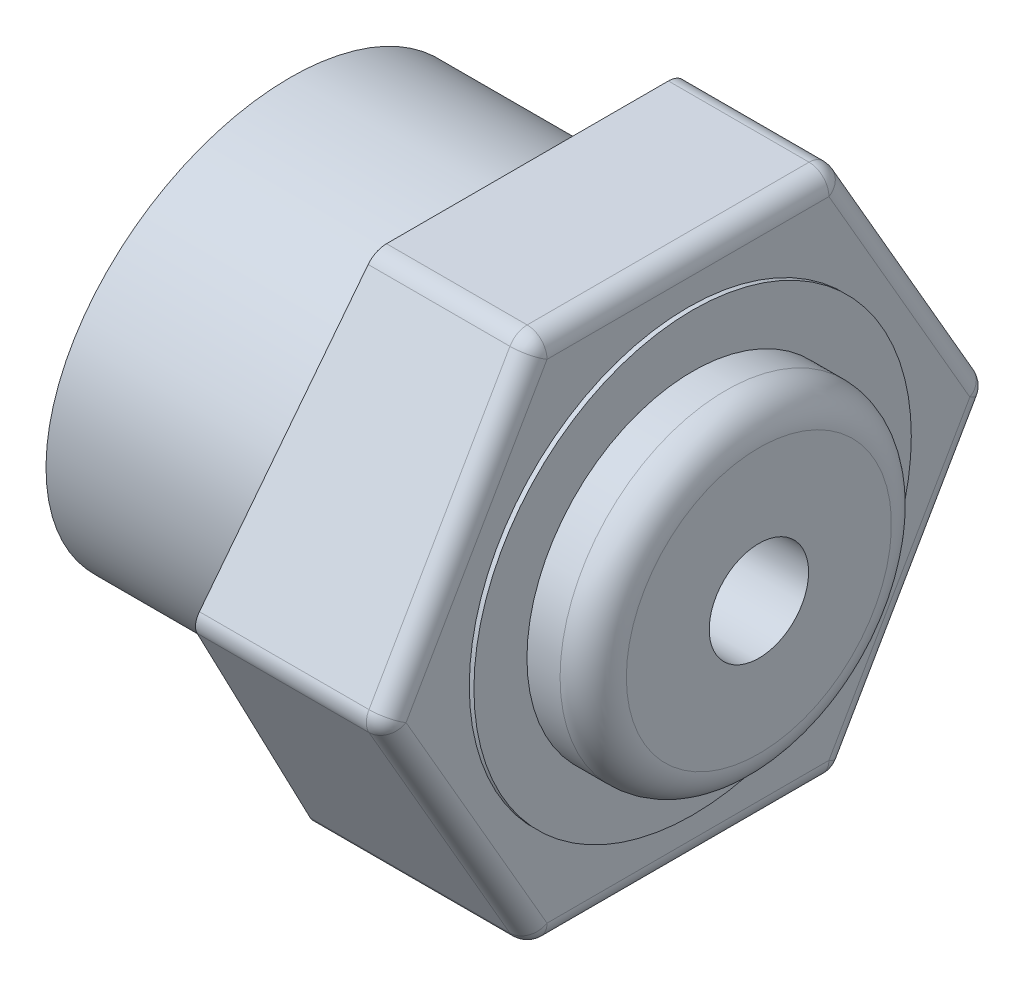
ISO-10303-21;
HEADER;
FILE_DESCRIPTION(('STEP AP214'),'2;1');
FILE_NAME('part.step','',(''),(''),'','','');
FILE_SCHEMA(('AUTOMOTIVE_DESIGN { 1 0 10303 214 1 1 1 1 }'));
ENDSEC;
DATA;
#1=APPLICATION_CONTEXT('core data for automotive mechanical design processes');
#2=APPLICATION_PROTOCOL_DEFINITION('international standard','automotive_design',2000,#1);
#3=PRODUCT_CONTEXT('',#1,'mechanical');
#4=PRODUCT('Part','Part','',(#3));
#5=PRODUCT_RELATED_PRODUCT_CATEGORY('part','',(#4));
#6=PRODUCT_DEFINITION_FORMATION('','',#4);
#7=PRODUCT_DEFINITION_CONTEXT('part definition',#1,'design');
#8=PRODUCT_DEFINITION('design','',#6,#7);
#9=PRODUCT_DEFINITION_SHAPE('','',#8);
#10=(LENGTH_UNIT() NAMED_UNIT(*) SI_UNIT(.MILLI.,.METRE.));
#11=(NAMED_UNIT(*) PLANE_ANGLE_UNIT() SI_UNIT($,.RADIAN.));
#12=(NAMED_UNIT(*) SI_UNIT($,.STERADIAN.) SOLID_ANGLE_UNIT());
#13=UNCERTAINTY_MEASURE_WITH_UNIT(LENGTH_MEASURE(1.E-05),#10,'distance_accuracy_value','');
#14=(GEOMETRIC_REPRESENTATION_CONTEXT(3) GLOBAL_UNCERTAINTY_ASSIGNED_CONTEXT((#13)) GLOBAL_UNIT_ASSIGNED_CONTEXT((#10,
#11,#12)) REPRESENTATION_CONTEXT('',''));
#15=CARTESIAN_POINT('',(0.,0.,0.));
#16=DIRECTION('',(0.,0.,1.));
#17=DIRECTION('',(1.,0.,0.));
#18=AXIS2_PLACEMENT_3D('',#15,#16,#17);
#19=CARTESIAN_POINT('',(3.33,3.98371685740838,2.30000000000004));
#20=DIRECTION('',(0.,-0.499999999999995,-0.866025403784441));
#21=DIRECTION('',(0.,0.866025403784441,-0.499999999999995));
#22=AXIS2_PLACEMENT_3D('',#19,#20,#21);
#23=PLANE('',#22);
#24=DIRECTION('',(-1.,0.,0.));
#25=VECTOR('',#24,1.);
#26=CARTESIAN_POINT('',(3.33,3.83371685740838,2.38660254037848));
#27=LINE('',#26,#25);
#28=CARTESIAN_POINT('',(3.03,3.83371685740838,2.38660254037848));
#29=VERTEX_POINT('',#28);
#30=CARTESIAN_POINT('',(0.890684065655473,3.83371685740838,2.38660254037848));
#31=VERTEX_POINT('',#30);
#32=EDGE_CURVE('E188',#29,#31,#27,.T.);
#33=ORIENTED_EDGE('',*,*,#32,.T.);
#34=DIRECTION('',(-0.0981942796621983,-0.861840131684074,0.497583632026216));
#35=VECTOR('',#34,1.);
#36=CARTESIAN_POINT('',(0.93112978840007,4.18870441000489,2.18165038132793));
#37=LINE('',#36,#35);
#38=CARTESIAN_POINT('',(0.470977544695609,0.15,4.51339745962155));
#39=VERTEX_POINT('',#38);
#40=EDGE_CURVE('E55',#31,#39,#37,.T.);
#41=ORIENTED_EDGE('',*,*,#40,.T.);
#42=DIRECTION('',(-1.,0.,0.));
#43=VECTOR('',#42,1.);
#44=CARTESIAN_POINT('',(3.33,0.15,4.51339745962155));
#45=LINE('',#44,#43);
#46=CARTESIAN_POINT('',(3.03,0.150000000000001,4.51339745962155));
#47=VERTEX_POINT('',#46);
#48=EDGE_CURVE('E62',#39,#47,#45,.F.);
#49=ORIENTED_EDGE('',*,*,#48,.T.);
#50=DIRECTION('',(0.,-0.866025403784441,0.499999999999995));
#51=VECTOR('',#50,1.);
#52=CARTESIAN_POINT('',(3.03,3.98371685740838,2.30000000000004));
#53=LINE('',#52,#51);
#54=EDGE_CURVE('E191',#47,#29,#53,.F.);
#55=ORIENTED_EDGE('',*,*,#54,.T.);
#56=EDGE_LOOP('',(#33,#41,#49,#55));
#57=FACE_BOUND('',#56,.T.);
#58=ADVANCED_FACE('F39',(#57),#23,.F.);
#59=CARTESIAN_POINT('',(3.33,0.,4.59999999999999));
#60=DIRECTION('',(0.,0.500000000000001,-0.866025403784438));
#61=DIRECTION('',(0.,0.866025403784438,0.500000000000001));
#62=AXIS2_PLACEMENT_3D('',#59,#60,#61);
#63=PLANE('',#62);
#64=DIRECTION('',(-1.,0.,0.));
#65=VECTOR('',#64,1.);
#66=CARTESIAN_POINT('',(3.33,-0.149999999999998,4.51339745962155));
#67=LINE('',#66,#65);
#68=CARTESIAN_POINT('',(3.03,-0.149999999999998,4.51339745962155));
#69=VERTEX_POINT('',#68);
#70=CARTESIAN_POINT('',(0.436796862205115,-0.149999999999998,4.51339745962155));
#71=VERTEX_POINT('',#70);
#72=EDGE_CURVE('E185',#69,#71,#67,.T.);
#73=ORIENTED_EDGE('',*,*,#72,.T.);
#74=DIRECTION('',(-0.098194279662198,-0.86184013168407,-0.497583632026222));
#75=VECTOR('',#74,1.);
#76=CARTESIAN_POINT('',(0.481619018269736,0.243399014871215,4.74052648675638));
#77=LINE('',#76,#75);
#78=CARTESIAN_POINT('',(0.0170903412452472,-3.83371685740842,2.38660254037843));
#79=VERTEX_POINT('',#78);
#80=EDGE_CURVE('E602',#71,#79,#77,.T.);
#81=ORIENTED_EDGE('',*,*,#80,.T.);
#82=DIRECTION('',(-1.,0.,0.));
#83=VECTOR('',#82,1.);
#84=CARTESIAN_POINT('',(3.33,-3.83371685740842,2.38660254037843));
#85=LINE('',#84,#83);
#86=CARTESIAN_POINT('',(3.03,-3.83371685740842,2.38660254037843));
#87=VERTEX_POINT('',#86);
#88=EDGE_CURVE('E181',#79,#87,#85,.F.);
#89=ORIENTED_EDGE('',*,*,#88,.T.);
#90=DIRECTION('',(0.,-0.866025403784438,-0.500000000000001));
#91=VECTOR('',#90,1.);
#92=CARTESIAN_POINT('',(3.03,0.,4.59999999999999));
#93=LINE('',#92,#91);
#94=EDGE_CURVE('E183',#87,#69,#93,.F.);
#95=ORIENTED_EDGE('',*,*,#94,.T.);
#96=EDGE_LOOP('',(#73,#81,#89,#95));
#97=FACE_BOUND('',#96,.T.);
#98=ADVANCED_FACE('F274',(#97),#63,.F.);
#99=CARTESIAN_POINT('',(3.33,-3.98371685740842,2.29999999999999));
#100=DIRECTION('',(0.,1.,0.));
#101=DIRECTION('',(0.,0.,1.));
#102=AXIS2_PLACEMENT_3D('',#99,#100,#101);
#103=PLANE('',#102);
#104=DIRECTION('',(0.,0.,-1.));
#105=VECTOR('',#104,1.);
#106=CARTESIAN_POINT('',(3.03,-3.98371685740842,2.29999999999999));
#107=LINE('',#106,#105);
#108=CARTESIAN_POINT('',(3.03,-3.9837168574084,-2.12679491924313));
#109=VERTEX_POINT('',#108);
#110=CARTESIAN_POINT('',(3.03,-3.98371685740842,2.1267949192431));
#111=VERTEX_POINT('',#110);
#112=EDGE_CURVE('E172',#109,#111,#107,.F.);
#113=ORIENTED_EDGE('',*,*,#112,.T.);
#114=DIRECTION('',(-1.,0.,0.));
#115=VECTOR('',#114,1.);
#116=CARTESIAN_POINT('',(3.33,-3.98371685740842,2.1267949192431));
#117=LINE('',#116,#115);
#118=CARTESIAN_POINT('',(0.,-3.98371685740842,2.1267949192431));
#119=VERTEX_POINT('',#118);
#120=EDGE_CURVE('E164',#111,#119,#117,.T.);
#121=ORIENTED_EDGE('',*,*,#120,.T.);
#122=DIRECTION('',(0.,0.,-1.));
#123=VECTOR('',#122,1.);
#124=CARTESIAN_POINT('',(0.,-3.98371685740842,2.29999999999999));
#125=LINE('',#124,#123);
#126=CARTESIAN_POINT('',(0.,-3.9837168574084,-2.12679491924312));
#127=VERTEX_POINT('',#126);
#128=EDGE_CURVE('E148',#119,#127,#125,.T.);
#129=ORIENTED_EDGE('',*,*,#128,.T.);
#130=DIRECTION('',(-1.,0.,0.));
#131=VECTOR('',#130,1.);
#132=CARTESIAN_POINT('',(3.33,-3.9837168574084,-2.12679491924312));
#133=LINE('',#132,#131);
#134=EDGE_CURVE('E161',#127,#109,#133,.F.);
#135=ORIENTED_EDGE('',*,*,#134,.T.);
#136=EDGE_LOOP('',(#113,#121,#129,#135));
#137=FACE_BOUND('',#136,.T.);
#138=ADVANCED_FACE('F160',(#137),#103,.F.);
#139=CARTESIAN_POINT('',(3.33,-3.9837168574084,-2.30000000000001));
#140=DIRECTION('',(0.,0.499999999999995,0.866025403784442));
#141=DIRECTION('',(0.,-0.866025403784442,0.499999999999995));
#142=AXIS2_PLACEMENT_3D('',#139,#140,#141);
#143=PLANE('',#142);
#144=DIRECTION('',(-1.,0.,0.));
#145=VECTOR('',#144,1.);
#146=CARTESIAN_POINT('',(3.33,-3.8337168574084,-2.38660254037846));
#147=LINE('',#146,#145);
#148=CARTESIAN_POINT('',(3.03,-3.8337168574084,-2.38660254037846));
#149=VERTEX_POINT('',#148);
#150=CARTESIAN_POINT('',(0.0170903412452491,-3.8337168574084,-2.38660254037846));
#151=VERTEX_POINT('',#150);
#152=EDGE_CURVE('E173',#149,#151,#147,.T.);
#153=ORIENTED_EDGE('',*,*,#152,.T.);
#154=DIRECTION('',(0.0981942796621983,0.861840131684074,-0.497583632026216));
#155=VECTOR('',#154,1.);
#156=CARTESIAN_POINT('',(0.0321082481394004,-3.70190638026248,-2.46270335484067));
#157=LINE('',#156,#155);
#158=CARTESIAN_POINT('',(0.436796862205119,-0.149999999999969,-4.51339745962155));
#159=VERTEX_POINT('',#158);
#160=EDGE_CURVE('E151',#151,#159,#157,.T.);
#161=ORIENTED_EDGE('',*,*,#160,.T.);
#162=DIRECTION('',(-1.,0.,0.));
#163=VECTOR('',#162,1.);
#164=CARTESIAN_POINT('',(3.33,-0.149999999999969,-4.51339745962155));
#165=LINE('',#164,#163);
#166=CARTESIAN_POINT('',(3.03,-0.149999999999969,-4.51339745962155));
#167=VERTEX_POINT('',#166);
#168=EDGE_CURVE('E637',#159,#167,#165,.F.);
#169=ORIENTED_EDGE('',*,*,#168,.T.);
#170=DIRECTION('',(0.,0.866025403784442,-0.499999999999995));
#171=VECTOR('',#170,1.);
#172=CARTESIAN_POINT('',(3.03,-3.9837168574084,-2.30000000000001));
#173=LINE('',#172,#171);
#174=EDGE_CURVE('E176',#167,#149,#173,.F.);
#175=ORIENTED_EDGE('',*,*,#174,.T.);
#176=EDGE_LOOP('',(#153,#161,#169,#175));
#177=FACE_BOUND('',#176,.T.);
#178=ADVANCED_FACE('F372',(#177),#143,.F.);
#179=CARTESIAN_POINT('',(3.33,0.,-4.59999999999999));
#180=DIRECTION('',(0.,-0.500000000000007,0.866025403784435));
#181=DIRECTION('',(0.,-0.866025403784435,-0.500000000000007));
#182=AXIS2_PLACEMENT_3D('',#179,#180,#181);
#183=PLANE('',#182);
#184=DIRECTION('',(-1.,0.,0.));
#185=VECTOR('',#184,1.);
#186=CARTESIAN_POINT('',(3.33,0.150000000000031,-4.51339745962155));
#187=LINE('',#186,#185);
#188=CARTESIAN_POINT('',(3.03,0.150000000000031,-4.51339745962155));
#189=VERTEX_POINT('',#188);
#190=CARTESIAN_POINT('',(0.470977544695613,0.150000000000031,-4.51339745962155));
#191=VERTEX_POINT('',#190);
#192=EDGE_CURVE('E634',#189,#191,#187,.T.);
#193=ORIENTED_EDGE('',*,*,#192,.T.);
#194=DIRECTION('',(0.0981942796621976,0.861840131684067,0.497583632026228));
#195=VECTOR('',#194,1.);
#196=CARTESIAN_POINT('',(0.481619018269739,0.243399014871244,-4.4594735132436));
#197=LINE('',#196,#195);
#198=CARTESIAN_POINT('',(0.890684065655478,3.83371685740843,-2.38660254037841));
#199=VERTEX_POINT('',#198);
#200=EDGE_CURVE('E599',#191,#199,#197,.T.);
#201=ORIENTED_EDGE('',*,*,#200,.T.);
#202=DIRECTION('',(-1.,0.,0.));
#203=VECTOR('',#202,1.);
#204=CARTESIAN_POINT('',(3.33,3.83371685740843,-2.38660254037841));
#205=LINE('',#204,#203);
#206=CARTESIAN_POINT('',(3.03,3.83371685740843,-2.3866025403784));
#207=VERTEX_POINT('',#206);
#208=EDGE_CURVE('E630',#199,#207,#205,.F.);
#209=ORIENTED_EDGE('',*,*,#208,.T.);
#210=DIRECTION('',(0.,0.866025403784435,0.500000000000007));
#211=VECTOR('',#210,1.);
#212=CARTESIAN_POINT('',(3.03,0.,-4.59999999999999));
#213=LINE('',#212,#211);
#214=EDGE_CURVE('E632',#207,#189,#213,.F.);
#215=ORIENTED_EDGE('',*,*,#214,.T.);
#216=EDGE_LOOP('',(#193,#201,#209,#215));
#217=FACE_BOUND('',#216,.T.);
#218=ADVANCED_FACE('F362',(#217),#183,.F.);
#219=CARTESIAN_POINT('',(3.33,3.98371685740843,-2.29999999999996));
#220=DIRECTION('',(0.,-1.,0.));
#221=DIRECTION('',(0.,0.,-1.));
#222=AXIS2_PLACEMENT_3D('',#219,#220,#221);
#223=PLANE('',#222);
#224=DIRECTION('',(-1.,0.,0.));
#225=VECTOR('',#224,1.);
#226=CARTESIAN_POINT('',(3.33,3.98371685740843,-2.12679491924307));
#227=LINE('',#226,#225);
#228=CARTESIAN_POINT('',(3.03,3.98371685740843,-2.12679491924307));
#229=VERTEX_POINT('',#228);
#230=CARTESIAN_POINT('',(0.907774406900726,3.98371685740843,-2.12679491924307));
#231=VERTEX_POINT('',#230);
#232=EDGE_CURVE('E622',#229,#231,#227,.T.);
#233=ORIENTED_EDGE('',*,*,#232,.T.);
#234=DIRECTION('',(0.,0.,1.));
#235=VECTOR('',#234,1.);
#236=CARTESIAN_POINT('',(0.907774406900726,3.98371685740843,-2.29999999999996));
#237=LINE('',#236,#235);
#238=CARTESIAN_POINT('',(0.90777440690072,3.98371685740838,2.12679491924315));
#239=VERTEX_POINT('',#238);
#240=EDGE_CURVE('E591',#231,#239,#237,.T.);
#241=ORIENTED_EDGE('',*,*,#240,.T.);
#242=DIRECTION('',(-1.,0.,0.));
#243=VECTOR('',#242,1.);
#244=CARTESIAN_POINT('',(3.33,3.98371685740838,2.12679491924315));
#245=LINE('',#244,#243);
#246=CARTESIAN_POINT('',(3.03,3.98371685740838,2.12679491924315));
#247=VERTEX_POINT('',#246);
#248=EDGE_CURVE('E628',#239,#247,#245,.F.);
#249=ORIENTED_EDGE('',*,*,#248,.T.);
#250=DIRECTION('',(0.,0.,1.));
#251=VECTOR('',#250,1.);
#252=CARTESIAN_POINT('',(3.03,3.98371685740843,-2.29999999999996));
#253=LINE('',#252,#251);
#254=EDGE_CURVE('E625',#247,#229,#253,.F.);
#255=ORIENTED_EDGE('',*,*,#254,.T.);
#256=EDGE_LOOP('',(#233,#241,#249,#255));
#257=FACE_BOUND('',#256,.T.);
#258=ADVANCED_FACE('F356',(#257),#223,.F.);
#259=CARTESIAN_POINT('',(3.33,0.,0.));
#260=DIRECTION('',(1.,0.,0.));
#261=DIRECTION('',(0.,0.,-1.));
#262=AXIS2_PLACEMENT_3D('',#259,#260,#261);
#263=PLANE('',#262);
#264=CARTESIAN_POINT('',(3.33,0.,0.));
#265=DIRECTION('',(1.,0.,0.));
#266=DIRECTION('',(0.,0.,-1.));
#267=AXIS2_PLACEMENT_3D('',#264,#265,#266);
#268=CIRCLE('',#267,3.3);
#269=CARTESIAN_POINT('',(3.33,0.,-3.3));
#270=VERTEX_POINT('',#269);
#271=EDGE_CURVE('E589',#270,#270,#268,.F.);
#272=ORIENTED_EDGE('',*,*,#271,.T.);
#273=EDGE_LOOP('',(#272));
#274=FACE_BOUND('',#273,.T.);
#275=DIRECTION('',(0.,0.866025403784435,0.500000000000007));
#276=VECTOR('',#275,1.);
#277=CARTESIAN_POINT('',(3.33,3.83371685740843,-2.04019237886463));
#278=LINE('',#277,#276);
#279=CARTESIAN_POINT('',(3.33,0.,-4.25358983848621));
#280=VERTEX_POINT('',#279);
#281=CARTESIAN_POINT('',(3.33,3.68371685740843,-2.12679491924307));
#282=VERTEX_POINT('',#281);
#283=EDGE_CURVE('E617',#280,#282,#278,.T.);
#284=ORIENTED_EDGE('',*,*,#283,.T.);
#285=DIRECTION('',(0.,0.,1.));
#286=VECTOR('',#285,1.);
#287=CARTESIAN_POINT('',(3.33,3.68371685740838,2.30000000000004));
#288=LINE('',#287,#286);
#289=CARTESIAN_POINT('',(3.33,3.68371685740838,2.12679491924315));
#290=VERTEX_POINT('',#289);
#291=EDGE_CURVE('E619',#282,#290,#288,.T.);
#292=ORIENTED_EDGE('',*,*,#291,.T.);
#293=DIRECTION('',(0.,-0.866025403784441,0.499999999999995));
#294=VECTOR('',#293,1.);
#295=CARTESIAN_POINT('',(3.33,-0.149999999999998,4.34019237886466));
#296=LINE('',#295,#294);
#297=CARTESIAN_POINT('',(3.33,0.,4.25358983848622));
#298=VERTEX_POINT('',#297);
#299=EDGE_CURVE('E165',#290,#298,#296,.T.);
#300=ORIENTED_EDGE('',*,*,#299,.T.);
#301=DIRECTION('',(0.,-0.866025403784438,-0.500000000000001));
#302=VECTOR('',#301,1.);
#303=CARTESIAN_POINT('',(3.33,-3.83371685740842,2.04019237886466));
#304=LINE('',#303,#302);
#305=CARTESIAN_POINT('',(3.33,-3.68371685740842,2.1267949192431));
#306=VERTEX_POINT('',#305);
#307=EDGE_CURVE('E611',#298,#306,#304,.T.);
#308=ORIENTED_EDGE('',*,*,#307,.T.);
#309=DIRECTION('',(0.,0.,-1.));
#310=VECTOR('',#309,1.);
#311=CARTESIAN_POINT('',(3.33,-3.6837168574084,-2.30000000000001));
#312=LINE('',#311,#310);
#313=CARTESIAN_POINT('',(3.33,-3.6837168574084,-2.12679491924312));
#314=VERTEX_POINT('',#313);
#315=EDGE_CURVE('E613',#306,#314,#312,.T.);
#316=ORIENTED_EDGE('',*,*,#315,.T.);
#317=DIRECTION('',(0.,0.866025403784442,-0.499999999999995));
#318=VECTOR('',#317,1.);
#319=CARTESIAN_POINT('',(3.33,0.150000000000031,-4.34019237886466));
#320=LINE('',#319,#318);
#321=EDGE_CURVE('E615',#314,#280,#320,.T.);
#322=ORIENTED_EDGE('',*,*,#321,.T.);
#323=EDGE_LOOP('',(#284,#292,#300,#308,#316,#322));
#324=FACE_BOUND('',#323,.T.);
#325=ADVANCED_FACE('F351',(#274,#324),#263,.T.);
#326=CARTESIAN_POINT('',(3.33,-3.6837168574084,-2.12679491924312));
#327=DIRECTION('',(-1.,0.,0.));
#328=DIRECTION('',(0.,0.,1.));
#329=AXIS2_PLACEMENT_3D('',#326,#327,#328);
#330=CYLINDRICAL_SURFACE('',#329,0.3);
#331=CARTESIAN_POINT('',(0.0341806824904964,-3.6837168574084,-2.12679491924312));
#332=DIRECTION('',(0.993571855676587,-0.11320321376791,0.));
#333=DIRECTION('',(-0.11320321376791,-0.993571855676587,0.));
#334=AXIS2_PLACEMENT_3D('',#331,#332,#333);
#335=ELLIPSE('',#334,0.301940919809681,0.3);
#336=EDGE_CURVE('E145',#151,#127,#335,.F.);
#337=ORIENTED_EDGE('',*,*,#336,.F.);
#338=ORIENTED_EDGE('',*,*,#152,.F.);
#339=CARTESIAN_POINT('',(3.03,-3.6837168574084,-2.12679491924312));
#340=DIRECTION('',(1.,0.,0.));
#341=DIRECTION('',(0.,0.,-1.));
#342=AXIS2_PLACEMENT_3D('',#339,#340,#341);
#343=CIRCLE('',#342,0.3);
#344=EDGE_CURVE('E166',#109,#149,#343,.T.);
#345=ORIENTED_EDGE('',*,*,#344,.F.);
#346=ORIENTED_EDGE('',*,*,#134,.F.);
#347=EDGE_LOOP('',(#337,#338,#345,#346));
#348=FACE_BOUND('',#347,.T.);
#349=ADVANCED_FACE('F169',(#348),#330,.T.);
#350=CARTESIAN_POINT('',(3.03,-3.68371685740841,0.));
#351=DIRECTION('',(0.,0.,1.));
#352=DIRECTION('',(0.,-1.,0.));
#353=AXIS2_PLACEMENT_3D('',#350,#351,#352);
#354=CYLINDRICAL_SURFACE('',#353,0.3);
#355=CARTESIAN_POINT('',(3.03,-3.68371685740842,2.1267949192431));
#356=DIRECTION('',(0.,0.,1.));
#357=DIRECTION('',(1.,0.,0.));
#358=AXIS2_PLACEMENT_3D('',#355,#356,#357);
#359=CIRCLE('',#358,0.3);
#360=EDGE_CURVE('E237',#111,#306,#359,.T.);
#361=ORIENTED_EDGE('',*,*,#360,.F.);
#362=ORIENTED_EDGE('',*,*,#112,.F.);
#363=CARTESIAN_POINT('',(3.03,-3.6837168574084,-2.12679491924312));
#364=DIRECTION('',(0.,0.,-1.));
#365=DIRECTION('',(0.,1.,0.));
#366=AXIS2_PLACEMENT_3D('',#363,#364,#365);
#367=CIRCLE('',#366,0.3);
#368=EDGE_CURVE('E240',#314,#109,#367,.T.);
#369=ORIENTED_EDGE('',*,*,#368,.F.);
#370=ORIENTED_EDGE('',*,*,#315,.F.);
#371=EDGE_LOOP('',(#361,#362,#369,#370));
#372=FACE_BOUND('',#371,.T.);
#373=ADVANCED_FACE('F346',(#372),#354,.T.);
#374=CARTESIAN_POINT('',(3.33,-3.68371685740842,2.1267949192431));
#375=DIRECTION('',(-1.,0.,0.));
#376=DIRECTION('',(0.,0.,1.));
#377=AXIS2_PLACEMENT_3D('',#374,#375,#376);
#378=CYLINDRICAL_SURFACE('',#377,0.3);
#379=CARTESIAN_POINT('',(0.0341806824904946,-3.68371685740842,2.1267949192431));
#380=DIRECTION('',(0.993571855676587,-0.11320321376791,0.));
#381=DIRECTION('',(-0.11320321376791,-0.993571855676587,0.));
#382=AXIS2_PLACEMENT_3D('',#379,#380,#381);
#383=ELLIPSE('',#382,0.301940919809681,0.3);
#384=EDGE_CURVE('E607',#119,#79,#383,.F.);
#385=ORIENTED_EDGE('',*,*,#384,.F.);
#386=ORIENTED_EDGE('',*,*,#120,.F.);
#387=CARTESIAN_POINT('',(3.03,-3.68371685740842,2.1267949192431));
#388=DIRECTION('',(1.,0.,0.));
#389=DIRECTION('',(0.,0.,-1.));
#390=AXIS2_PLACEMENT_3D('',#387,#388,#389);
#391=CIRCLE('',#390,0.3);
#392=EDGE_CURVE('E234',#87,#111,#391,.T.);
#393=ORIENTED_EDGE('',*,*,#392,.F.);
#394=ORIENTED_EDGE('',*,*,#88,.F.);
#395=EDGE_LOOP('',(#385,#386,#393,#394));
#396=FACE_BOUND('',#395,.T.);
#397=ADVANCED_FACE('F342',(#396),#378,.T.);
#398=CARTESIAN_POINT('',(3.03,-3.6837168574084,-2.12679491924312));
#399=DIRECTION('',(1.,0.,0.));
#400=DIRECTION('',(0.,0.,-1.));
#401=AXIS2_PLACEMENT_3D('',#398,#399,#400);
#402=SPHERICAL_SURFACE('',#401,0.3);
#403=ORIENTED_EDGE('',*,*,#368,.T.);
#404=ORIENTED_EDGE('',*,*,#344,.T.);
#405=CARTESIAN_POINT('',(3.03,-3.6837168574084,-2.12679491924312));
#406=DIRECTION('',(0.,-0.866025403784441,0.499999999999996));
#407=DIRECTION('',(0.,-0.499999999999996,-0.866025403784441));
#408=AXIS2_PLACEMENT_3D('',#405,#406,#407);
#409=CIRCLE('',#408,0.3);
#410=EDGE_CURVE('E231',#314,#149,#409,.F.);
#411=ORIENTED_EDGE('',*,*,#410,.F.);
#412=EDGE_LOOP('',(#403,#404,#411));
#413=FACE_BOUND('',#412,.T.);
#414=ADVANCED_FACE('F338',(#413),#402,.T.);
#415=CARTESIAN_POINT('',(3.03,-3.68371685740842,2.1267949192431));
#416=DIRECTION('',(1.,0.,0.));
#417=DIRECTION('',(0.,0.,-1.));
#418=AXIS2_PLACEMENT_3D('',#415,#416,#417);
#419=SPHERICAL_SURFACE('',#418,0.3);
#420=ORIENTED_EDGE('',*,*,#392,.T.);
#421=ORIENTED_EDGE('',*,*,#360,.T.);
#422=CARTESIAN_POINT('',(3.03,-3.68371685740842,2.1267949192431));
#423=DIRECTION('',(0.,-0.866025403784437,-0.500000000000002));
#424=DIRECTION('',(0.,0.500000000000002,-0.866025403784437));
#425=AXIS2_PLACEMENT_3D('',#422,#423,#424);
#426=CIRCLE('',#425,0.3);
#427=EDGE_CURVE('E228',#87,#306,#426,.F.);
#428=ORIENTED_EDGE('',*,*,#427,.F.);
#429=EDGE_LOOP('',(#420,#421,#428));
#430=FACE_BOUND('',#429,.T.);
#431=ADVANCED_FACE('F334',(#430),#419,.T.);
#432=CARTESIAN_POINT('',(3.33,0.,-4.25358983848622));
#433=DIRECTION('',(-1.,0.,0.));
#434=DIRECTION('',(0.,0.,1.));
#435=AXIS2_PLACEMENT_3D('',#432,#433,#434);
#436=CYLINDRICAL_SURFACE('',#435,0.3);
#437=CARTESIAN_POINT('',(0.453887203450366,0.,-4.25358983848622));
#438=DIRECTION('',(0.993571855676587,-0.11320321376791,0.));
#439=DIRECTION('',(-0.11320321376791,-0.993571855676587,0.));
#440=AXIS2_PLACEMENT_3D('',#437,#438,#439);
#441=ELLIPSE('',#440,0.301940919809681,0.3);
#442=EDGE_CURVE('E605',#191,#159,#441,.F.);
#443=ORIENTED_EDGE('',*,*,#442,.F.);
#444=ORIENTED_EDGE('',*,*,#192,.F.);
#445=CARTESIAN_POINT('',(3.03,0.,-4.25358983848622));
#446=DIRECTION('',(1.,0.,0.));
#447=DIRECTION('',(0.,0.,-1.));
#448=AXIS2_PLACEMENT_3D('',#445,#446,#447);
#449=CIRCLE('',#448,0.3);
#450=EDGE_CURVE('E225',#167,#189,#449,.T.);
#451=ORIENTED_EDGE('',*,*,#450,.F.);
#452=ORIENTED_EDGE('',*,*,#168,.F.);
#453=EDGE_LOOP('',(#443,#444,#451,#452));
#454=FACE_BOUND('',#453,.T.);
#455=ADVANCED_FACE('F330',(#454),#436,.T.);
#456=CARTESIAN_POINT('',(3.03,-1.84185842870419,-3.19019237886467));
#457=DIRECTION('',(0.,-0.866025403784442,0.499999999999995));
#458=DIRECTION('',(0.,-0.499999999999995,-0.866025403784442));
#459=AXIS2_PLACEMENT_3D('',#456,#457,#458);
#460=CYLINDRICAL_SURFACE('',#459,0.3);
#461=ORIENTED_EDGE('',*,*,#410,.T.);
#462=ORIENTED_EDGE('',*,*,#174,.F.);
#463=CARTESIAN_POINT('',(3.03,0.,-4.25358983848621));
#464=DIRECTION('',(0.,0.866025403784442,-0.499999999999994));
#465=DIRECTION('',(0.,0.499999999999994,0.866025403784442));
#466=AXIS2_PLACEMENT_3D('',#463,#464,#465);
#467=CIRCLE('',#466,0.3);
#468=EDGE_CURVE('E222',#280,#167,#467,.T.);
#469=ORIENTED_EDGE('',*,*,#468,.F.);
#470=ORIENTED_EDGE('',*,*,#321,.F.);
#471=EDGE_LOOP('',(#461,#462,#469,#470));
#472=FACE_BOUND('',#471,.T.);
#473=ADVANCED_FACE('F326',(#472),#460,.T.);
#474=CARTESIAN_POINT('',(3.03,-1.84185842870421,3.19019237886466));
#475=DIRECTION('',(0.,0.866025403784438,0.500000000000001));
#476=DIRECTION('',(0.,-0.500000000000001,0.866025403784438));
#477=AXIS2_PLACEMENT_3D('',#474,#475,#476);
#478=CYLINDRICAL_SURFACE('',#477,0.3);
#479=ORIENTED_EDGE('',*,*,#427,.T.);
#480=ORIENTED_EDGE('',*,*,#307,.F.);
#481=CARTESIAN_POINT('',(3.03,0.,4.25358983848622));
#482=DIRECTION('',(0.,0.866025403784438,0.500000000000001));
#483=DIRECTION('',(0.,-0.500000000000001,0.866025403784438));
#484=AXIS2_PLACEMENT_3D('',#481,#482,#483);
#485=CIRCLE('',#484,0.3);
#486=EDGE_CURVE('E219',#69,#298,#485,.T.);
#487=ORIENTED_EDGE('',*,*,#486,.F.);
#488=ORIENTED_EDGE('',*,*,#94,.F.);
#489=EDGE_LOOP('',(#479,#480,#487,#488));
#490=FACE_BOUND('',#489,.T.);
#491=ADVANCED_FACE('F322',(#490),#478,.T.);
#492=CARTESIAN_POINT('',(3.33,0.,4.25358983848622));
#493=DIRECTION('',(-1.,0.,0.));
#494=DIRECTION('',(0.,0.,1.));
#495=AXIS2_PLACEMENT_3D('',#492,#493,#494);
#496=CYLINDRICAL_SURFACE('',#495,0.3);
#497=CARTESIAN_POINT('',(0.453887203450362,0.,4.25358983848622));
#498=DIRECTION('',(0.993571855676587,-0.11320321376791,0.));
#499=DIRECTION('',(-0.11320321376791,-0.993571855676587,0.));
#500=AXIS2_PLACEMENT_3D('',#497,#498,#499);
#501=ELLIPSE('',#500,0.301940919809681,0.3);
#502=EDGE_CURVE('E597',#71,#39,#501,.F.);
#503=ORIENTED_EDGE('',*,*,#502,.F.);
#504=ORIENTED_EDGE('',*,*,#72,.F.);
#505=CARTESIAN_POINT('',(3.03,0.,4.25358983848622));
#506=DIRECTION('',(1.,0.,0.));
#507=DIRECTION('',(0.,0.,-1.));
#508=AXIS2_PLACEMENT_3D('',#505,#506,#507);
#509=CIRCLE('',#508,0.3);
#510=EDGE_CURVE('E216',#47,#69,#509,.T.);
#511=ORIENTED_EDGE('',*,*,#510,.F.);
#512=ORIENTED_EDGE('',*,*,#48,.F.);
#513=EDGE_LOOP('',(#503,#504,#511,#512));
#514=FACE_BOUND('',#513,.T.);
#515=ADVANCED_FACE('F318',(#514),#496,.T.);
#516=CARTESIAN_POINT('',(3.03,0.,-4.25358983848622));
#517=DIRECTION('',(1.,0.,0.));
#518=DIRECTION('',(0.,0.,-1.));
#519=AXIS2_PLACEMENT_3D('',#516,#517,#518);
#520=SPHERICAL_SURFACE('',#519,0.3);
#521=ORIENTED_EDGE('',*,*,#468,.T.);
#522=ORIENTED_EDGE('',*,*,#450,.T.);
#523=CARTESIAN_POINT('',(3.03,0.,-4.25358983848622));
#524=DIRECTION('',(0.,-0.866025403784435,-0.500000000000007));
#525=DIRECTION('',(0.,0.500000000000007,-0.866025403784435));
#526=AXIS2_PLACEMENT_3D('',#523,#524,#525);
#527=CIRCLE('',#526,0.3);
#528=EDGE_CURVE('E213',#280,#189,#527,.F.);
#529=ORIENTED_EDGE('',*,*,#528,.F.);
#530=EDGE_LOOP('',(#521,#522,#529));
#531=FACE_BOUND('',#530,.T.);
#532=ADVANCED_FACE('F314',(#531),#520,.T.);
#533=CARTESIAN_POINT('',(3.03,0.,4.25358983848622));
#534=DIRECTION('',(1.,0.,0.));
#535=DIRECTION('',(0.,0.,-1.));
#536=AXIS2_PLACEMENT_3D('',#533,#534,#535);
#537=SPHERICAL_SURFACE('',#536,0.3);
#538=ORIENTED_EDGE('',*,*,#510,.T.);
#539=ORIENTED_EDGE('',*,*,#486,.T.);
#540=CARTESIAN_POINT('',(3.03,0.,4.25358983848622));
#541=DIRECTION('',(0.,-0.86602540378444,0.499999999999997));
#542=DIRECTION('',(0.,-0.499999999999997,-0.86602540378444));
#543=AXIS2_PLACEMENT_3D('',#540,#541,#542);
#544=CIRCLE('',#543,0.3);
#545=EDGE_CURVE('E210',#47,#298,#544,.F.);
#546=ORIENTED_EDGE('',*,*,#545,.F.);
#547=EDGE_LOOP('',(#538,#539,#546));
#548=FACE_BOUND('',#547,.T.);
#549=ADVANCED_FACE('F310',(#548),#537,.T.);
#550=CARTESIAN_POINT('',(3.33,3.68371685740843,-2.12679491924307));
#551=DIRECTION('',(-1.,0.,0.));
#552=DIRECTION('',(0.,0.,1.));
#553=AXIS2_PLACEMENT_3D('',#550,#551,#552);
#554=CYLINDRICAL_SURFACE('',#553,0.3);
#555=CARTESIAN_POINT('',(0.873593724410231,3.68371685740843,-2.12679491924307));
#556=DIRECTION('',(0.993571855676587,-0.11320321376791,0.));
#557=DIRECTION('',(-0.11320321376791,-0.993571855676587,0.));
#558=AXIS2_PLACEMENT_3D('',#555,#556,#557);
#559=ELLIPSE('',#558,0.301940919809681,0.3);
#560=EDGE_CURVE('E595',#231,#199,#559,.F.);
#561=ORIENTED_EDGE('',*,*,#560,.F.);
#562=ORIENTED_EDGE('',*,*,#232,.F.);
#563=CARTESIAN_POINT('',(3.03,3.68371685740843,-2.12679491924307));
#564=DIRECTION('',(1.,0.,0.));
#565=DIRECTION('',(0.,0.,-1.));
#566=AXIS2_PLACEMENT_3D('',#563,#564,#565);
#567=CIRCLE('',#566,0.3);
#568=EDGE_CURVE('E207',#207,#229,#567,.T.);
#569=ORIENTED_EDGE('',*,*,#568,.F.);
#570=ORIENTED_EDGE('',*,*,#208,.F.);
#571=EDGE_LOOP('',(#561,#562,#569,#570));
#572=FACE_BOUND('',#571,.T.);
#573=ADVANCED_FACE('F306',(#572),#554,.T.);
#574=CARTESIAN_POINT('',(3.03,1.84185842870423,-3.19019237886464));
#575=DIRECTION('',(0.,-0.866025403784435,-0.500000000000007));
#576=DIRECTION('',(0.,0.500000000000007,-0.866025403784435));
#577=AXIS2_PLACEMENT_3D('',#574,#575,#576);
#578=CYLINDRICAL_SURFACE('',#577,0.3);
#579=ORIENTED_EDGE('',*,*,#528,.T.);
#580=ORIENTED_EDGE('',*,*,#214,.F.);
#581=CARTESIAN_POINT('',(3.03,3.68371685740843,-2.12679491924307));
#582=DIRECTION('',(0.,0.866025403784435,0.500000000000007));
#583=DIRECTION('',(0.,-0.500000000000007,0.866025403784435));
#584=AXIS2_PLACEMENT_3D('',#581,#582,#583);
#585=CIRCLE('',#584,0.3);
#586=EDGE_CURVE('E204',#282,#207,#585,.T.);
#587=ORIENTED_EDGE('',*,*,#586,.F.);
#588=ORIENTED_EDGE('',*,*,#283,.F.);
#589=EDGE_LOOP('',(#579,#580,#587,#588));
#590=FACE_BOUND('',#589,.T.);
#591=ADVANCED_FACE('F302',(#590),#578,.T.);
#592=CARTESIAN_POINT('',(3.03,1.8418584287042,3.19019237886468));
#593=DIRECTION('',(0.,0.866025403784441,-0.499999999999995));
#594=DIRECTION('',(0.,0.499999999999995,0.866025403784441));
#595=AXIS2_PLACEMENT_3D('',#592,#593,#594);
#596=CYLINDRICAL_SURFACE('',#595,0.3);
#597=ORIENTED_EDGE('',*,*,#545,.T.);
#598=ORIENTED_EDGE('',*,*,#299,.F.);
#599=CARTESIAN_POINT('',(3.03,3.68371685740838,2.12679491924315));
#600=DIRECTION('',(0.,0.866025403784441,-0.499999999999996));
#601=DIRECTION('',(0.,0.499999999999996,0.866025403784441));
#602=AXIS2_PLACEMENT_3D('',#599,#600,#601);
#603=CIRCLE('',#602,0.3);
#604=EDGE_CURVE('E201',#29,#290,#603,.T.);
#605=ORIENTED_EDGE('',*,*,#604,.F.);
#606=ORIENTED_EDGE('',*,*,#54,.F.);
#607=EDGE_LOOP('',(#597,#598,#605,#606));
#608=FACE_BOUND('',#607,.T.);
#609=ADVANCED_FACE('F298',(#608),#596,.T.);
#610=CARTESIAN_POINT('',(3.33,3.68371685740838,2.12679491924315));
#611=DIRECTION('',(-1.,0.,0.));
#612=DIRECTION('',(0.,0.,1.));
#613=AXIS2_PLACEMENT_3D('',#610,#611,#612);
#614=CYLINDRICAL_SURFACE('',#613,0.3);
#615=CARTESIAN_POINT('',(0.873593724410226,3.68371685740838,2.12679491924315));
#616=DIRECTION('',(0.993571855676587,-0.11320321376791,0.));
#617=DIRECTION('',(-0.11320321376791,-0.993571855676587,0.));
#618=AXIS2_PLACEMENT_3D('',#615,#616,#617);
#619=ELLIPSE('',#618,0.301940919809681,0.3);
#620=EDGE_CURVE('E194',#31,#239,#619,.F.);
#621=ORIENTED_EDGE('',*,*,#620,.F.);
#622=ORIENTED_EDGE('',*,*,#32,.F.);
#623=CARTESIAN_POINT('',(3.03,3.68371685740838,2.12679491924315));
#624=DIRECTION('',(1.,0.,0.));
#625=DIRECTION('',(0.,0.,-1.));
#626=AXIS2_PLACEMENT_3D('',#623,#624,#625);
#627=CIRCLE('',#626,0.3);
#628=EDGE_CURVE('E198',#247,#29,#627,.T.);
#629=ORIENTED_EDGE('',*,*,#628,.F.);
#630=ORIENTED_EDGE('',*,*,#248,.F.);
#631=EDGE_LOOP('',(#621,#622,#629,#630));
#632=FACE_BOUND('',#631,.T.);
#633=ADVANCED_FACE('F294',(#632),#614,.T.);
#634=CARTESIAN_POINT('',(3.03,3.68371685740843,-2.12679491924307));
#635=DIRECTION('',(1.,0.,0.));
#636=DIRECTION('',(0.,0.,-1.));
#637=AXIS2_PLACEMENT_3D('',#634,#635,#636);
#638=SPHERICAL_SURFACE('',#637,0.3);
#639=ORIENTED_EDGE('',*,*,#586,.T.);
#640=ORIENTED_EDGE('',*,*,#568,.T.);
#641=CARTESIAN_POINT('',(3.03,3.68371685740843,-2.12679491924307));
#642=DIRECTION('',(0.,0.,-1.));
#643=DIRECTION('',(0.,1.,0.));
#644=AXIS2_PLACEMENT_3D('',#641,#642,#643);
#645=CIRCLE('',#644,0.3);
#646=EDGE_CURVE('E196',#282,#229,#645,.F.);
#647=ORIENTED_EDGE('',*,*,#646,.F.);
#648=EDGE_LOOP('',(#639,#640,#647));
#649=FACE_BOUND('',#648,.T.);
#650=ADVANCED_FACE('F290',(#649),#638,.T.);
#651=CARTESIAN_POINT('',(3.03,3.68371685740838,2.12679491924315));
#652=DIRECTION('',(1.,0.,0.));
#653=DIRECTION('',(0.,0.,-1.));
#654=AXIS2_PLACEMENT_3D('',#651,#652,#653);
#655=SPHERICAL_SURFACE('',#654,0.3);
#656=ORIENTED_EDGE('',*,*,#628,.T.);
#657=ORIENTED_EDGE('',*,*,#604,.T.);
#658=CARTESIAN_POINT('',(3.03,3.68371685740838,2.12679491924315));
#659=DIRECTION('',(0.,0.,1.));
#660=DIRECTION('',(0.,-1.,0.));
#661=AXIS2_PLACEMENT_3D('',#658,#659,#660);
#662=CIRCLE('',#661,0.3);
#663=EDGE_CURVE('E156',#247,#290,#662,.F.);
#664=ORIENTED_EDGE('',*,*,#663,.F.);
#665=EDGE_LOOP('',(#656,#657,#664));
#666=FACE_BOUND('',#665,.T.);
#667=ADVANCED_FACE('F286',(#666),#655,.T.);
#668=CARTESIAN_POINT('',(3.03,3.68371685740841,0.));
#669=DIRECTION('',(0.,0.,-1.));
#670=DIRECTION('',(0.,1.,0.));
#671=AXIS2_PLACEMENT_3D('',#668,#669,#670);
#672=CYLINDRICAL_SURFACE('',#671,0.3);
#673=ORIENTED_EDGE('',*,*,#646,.T.);
#674=ORIENTED_EDGE('',*,*,#254,.F.);
#675=ORIENTED_EDGE('',*,*,#663,.T.);
#676=ORIENTED_EDGE('',*,*,#291,.F.);
#677=EDGE_LOOP('',(#673,#674,#675,#676));
#678=FACE_BOUND('',#677,.T.);
#679=ADVANCED_FACE('F284',(#678),#672,.T.);
#680=CARTESIAN_POINT('',(0.,-3.98371685740842,-9.95));
#681=DIRECTION('',(0.993571855676587,-0.11320321376791,0.));
#682=DIRECTION('',(0.11320321376791,0.993571855676587,0.));
#683=AXIS2_PLACEMENT_3D('',#680,#681,#682);
#684=PLANE('',#683);
#685=CARTESIAN_POINT('',(0.453887203450362,0.,0.));
#686=DIRECTION('',(0.993571855676587,-0.11320321376791,0.));
#687=DIRECTION('',(0.11320321376791,0.993571855676587,0.));
#688=AXIS2_PLACEMENT_3D('',#685,#686,#687);
#689=ELLIPSE('',#688,3.32135011790649,3.3);
#690=CARTESIAN_POINT('',(0.829874710845805,3.3,0.));
#691=VERTEX_POINT('',#690);
#692=EDGE_CURVE('E244',#691,#691,#689,.F.);
#693=ORIENTED_EDGE('',*,*,#692,.F.);
#694=EDGE_LOOP('',(#693));
#695=FACE_BOUND('',#694,.T.);
#696=ORIENTED_EDGE('',*,*,#336,.T.);
#697=ORIENTED_EDGE('',*,*,#128,.F.);
#698=ORIENTED_EDGE('',*,*,#384,.T.);
#699=ORIENTED_EDGE('',*,*,#80,.F.);
#700=ORIENTED_EDGE('',*,*,#502,.T.);
#701=ORIENTED_EDGE('',*,*,#40,.F.);
#702=ORIENTED_EDGE('',*,*,#620,.T.);
#703=ORIENTED_EDGE('',*,*,#240,.F.);
#704=ORIENTED_EDGE('',*,*,#560,.T.);
#705=ORIENTED_EDGE('',*,*,#200,.F.);
#706=ORIENTED_EDGE('',*,*,#442,.T.);
#707=ORIENTED_EDGE('',*,*,#160,.F.);
#708=EDGE_LOOP('',(#696,#697,#698,#699,#700,#701,#702,#703,#704,#705,#706,#707));
#709=FACE_BOUND('',#708,.T.);
#710=ADVANCED_FACE('F147',(#695,#709),#684,.F.);
#711=CARTESIAN_POINT('',(-3.4,0.,0.));
#712=DIRECTION('',(1.,0.,0.));
#713=DIRECTION('',(0.,0.,-1.));
#714=AXIS2_PLACEMENT_3D('',#711,#712,#713);
#715=CYLINDRICAL_SURFACE('',#714,3.3);
#716=CARTESIAN_POINT('',(-3.037425443255,0.,0.));
#717=DIRECTION('',(0.994018275953466,-0.109213859333411,0.));
#718=DIRECTION('',(0.109213859333411,0.994018275953467,0.));
#719=AXIS2_PLACEMENT_3D('',#716,#717,#718);
#720=ELLIPSE('',#719,3.31985847728466,3.3);
#721=CARTESIAN_POINT('',(-2.67485088651,3.3,0.));
#722=VERTEX_POINT('',#721);
#723=EDGE_CURVE('E582',#722,#722,#720,.T.);
#724=ORIENTED_EDGE('',*,*,#723,.T.);
#725=EDGE_LOOP('',(#724));
#726=FACE_BOUND('',#725,.T.);
#727=ORIENTED_EDGE('',*,*,#692,.T.);
#728=EDGE_LOOP('',(#727));
#729=FACE_BOUND('',#728,.T.);
#730=ADVANCED_FACE('F515',(#726,#729),#715,.T.);
#731=ORIENTED_EDGE('',*,*,#271,.F.);
#732=EDGE_LOOP('',(#731));
#733=FACE_BOUND('',#732,.T.);
#734=CARTESIAN_POINT('',(3.4,0.,0.));
#735=DIRECTION('',(-1.,0.,0.));
#736=DIRECTION('',(0.,0.,1.));
#737=AXIS2_PLACEMENT_3D('',#734,#735,#736);
#738=CIRCLE('',#737,3.3);
#739=CARTESIAN_POINT('',(3.4,0.,3.3));
#740=VERTEX_POINT('',#739);
#741=EDGE_CURVE('E250',#740,#740,#738,.T.);
#742=ORIENTED_EDGE('',*,*,#741,.T.);
#743=EDGE_LOOP('',(#742));
#744=FACE_BOUND('',#743,.T.);
#745=ADVANCED_FACE('F525',(#733,#744),#715,.T.);
#746=CARTESIAN_POINT('',(3.4,0.,0.));
#747=DIRECTION('',(-1.,0.,0.));
#748=DIRECTION('',(0.,0.,1.));
#749=AXIS2_PLACEMENT_3D('',#746,#747,#748);
#750=PLANE('',#749);
#751=CARTESIAN_POINT('',(3.4,0.,0.));
#752=DIRECTION('',(-1.,0.,0.));
#753=DIRECTION('',(0.,0.,1.));
#754=AXIS2_PLACEMENT_3D('',#751,#752,#753);
#755=CIRCLE('',#754,2.5);
#756=CARTESIAN_POINT('',(3.4,0.,2.5));
#757=VERTEX_POINT('',#756);
#758=EDGE_CURVE('E247',#757,#757,#755,.T.);
#759=ORIENTED_EDGE('',*,*,#758,.T.);
#760=EDGE_LOOP('',(#759));
#761=FACE_BOUND('',#760,.T.);
#762=ORIENTED_EDGE('',*,*,#741,.F.);
#763=EDGE_LOOP('',(#762));
#764=FACE_BOUND('',#763,.T.);
#765=ADVANCED_FACE('F533',(#761,#764),#750,.F.);
#766=CARTESIAN_POINT('',(4.4,0.,0.));
#767=DIRECTION('',(-1.,0.,0.));
#768=DIRECTION('',(0.,0.,1.));
#769=AXIS2_PLACEMENT_3D('',#766,#767,#768);
#770=CYLINDRICAL_SURFACE('',#769,2.5);
#771=CARTESIAN_POINT('',(3.9,0.,0.));
#772=DIRECTION('',(-1.,0.,0.));
#773=DIRECTION('',(0.,0.,1.));
#774=AXIS2_PLACEMENT_3D('',#771,#772,#773);
#775=CIRCLE('',#774,2.5);
#776=CARTESIAN_POINT('',(3.9,0.,2.5));
#777=VERTEX_POINT('',#776);
#778=EDGE_CURVE('E48',#777,#777,#775,.T.);
#779=ORIENTED_EDGE('',*,*,#778,.T.);
#780=EDGE_LOOP('',(#779));
#781=FACE_BOUND('',#780,.T.);
#782=ORIENTED_EDGE('',*,*,#758,.F.);
#783=EDGE_LOOP('',(#782));
#784=FACE_BOUND('',#783,.T.);
#785=ADVANCED_FACE('F255',(#781,#784),#770,.T.);
#786=CARTESIAN_POINT('',(4.4,0.,0.));
#787=DIRECTION('',(-1.,0.,0.));
#788=DIRECTION('',(0.,0.,1.));
#789=AXIS2_PLACEMENT_3D('',#786,#787,#788);
#790=PLANE('',#789);
#791=CARTESIAN_POINT('',(4.4,0.,0.));
#792=DIRECTION('',(1.,0.,0.));
#793=DIRECTION('',(0.,0.,-1.));
#794=AXIS2_PLACEMENT_3D('',#791,#792,#793);
#795=CIRCLE('',#794,0.75);
#796=CARTESIAN_POINT('',(4.4,0.,-0.75));
#797=VERTEX_POINT('',#796);
#798=EDGE_CURVE('E251',#797,#797,#795,.T.);
#799=ORIENTED_EDGE('',*,*,#798,.F.);
#800=EDGE_LOOP('',(#799));
#801=FACE_BOUND('',#800,.T.);
#802=CARTESIAN_POINT('',(4.4,0.,0.));
#803=DIRECTION('',(-1.,0.,0.));
#804=DIRECTION('',(0.,0.,1.));
#805=AXIS2_PLACEMENT_3D('',#802,#803,#804);
#806=CIRCLE('',#805,2.);
#807=CARTESIAN_POINT('',(4.4,0.,2.));
#808=VERTEX_POINT('',#807);
#809=EDGE_CURVE('E11',#808,#808,#806,.F.);
#810=ORIENTED_EDGE('',*,*,#809,.T.);
#811=EDGE_LOOP('',(#810));
#812=FACE_BOUND('',#811,.T.);
#813=ADVANCED_FACE('F260',(#801,#812),#790,.F.);
#814=CARTESIAN_POINT('',(3.9,0.,0.));
#815=DIRECTION('',(-1.,0.,0.));
#816=DIRECTION('',(0.,0.,1.));
#817=AXIS2_PLACEMENT_3D('',#814,#815,#816);
#818=TOROIDAL_SURFACE('',#817,2.,0.5);
#819=ORIENTED_EDGE('',*,*,#809,.F.);
#820=EDGE_LOOP('',(#819));
#821=FACE_BOUND('',#820,.T.);
#822=ORIENTED_EDGE('',*,*,#778,.F.);
#823=EDGE_LOOP('',(#822));
#824=FACE_BOUND('',#823,.T.);
#825=ADVANCED_FACE('F41',(#821,#824),#818,.T.);
#826=CARTESIAN_POINT('',(-3.4,0.,0.));
#827=DIRECTION('',(1.,0.,0.));
#828=DIRECTION('',(0.,0.,-1.));
#829=AXIS2_PLACEMENT_3D('',#826,#827,#828);
#830=CYLINDRICAL_SURFACE('',#829,0.75);
#831=CARTESIAN_POINT('',(-3.037425443255,0.,0.));
#832=DIRECTION('',(0.994018275953466,-0.109213859333411,0.));
#833=DIRECTION('',(0.109213859333411,0.994018275953467,0.));
#834=AXIS2_PLACEMENT_3D('',#831,#832,#833);
#835=ELLIPSE('',#834,0.754513290291969,0.75);
#836=CARTESIAN_POINT('',(-2.95502213490386,0.75,0.));
#837=VERTEX_POINT('',#836);
#838=EDGE_CURVE('E43',#837,#837,#835,.F.);
#839=ORIENTED_EDGE('',*,*,#838,.T.);
#840=EDGE_LOOP('',(#839));
#841=FACE_BOUND('',#840,.T.);
#842=ORIENTED_EDGE('',*,*,#798,.T.);
#843=EDGE_LOOP('',(#842));
#844=FACE_BOUND('',#843,.T.);
#845=ADVANCED_FACE('F259',(#841,#844),#830,.F.);
#846=CARTESIAN_POINT('',(-3.4,-3.3,-3.9));
#847=DIRECTION('',(0.994018275953466,-0.109213859333411,0.));
#848=DIRECTION('',(0.109213859333411,0.994018275953467,0.));
#849=AXIS2_PLACEMENT_3D('',#846,#847,#848);
#850=PLANE('',#849);
#851=ORIENTED_EDGE('',*,*,#838,.F.);
#852=EDGE_LOOP('',(#851));
#853=FACE_BOUND('',#852,.T.);
#854=ORIENTED_EDGE('',*,*,#723,.F.);
#855=EDGE_LOOP('',(#854));
#856=FACE_BOUND('',#855,.T.);
#857=ADVANCED_FACE('F267',(#853,#856),#850,.F.);
#858=CLOSED_SHELL('',(#58,#98,#138,#178,#218,#258,#325,#349,#373,#397,#414,#431,#455,#473,#491,
#515,#532,#549,#573,#591,#609,#633,#650,#667,#679,#710,#730,#745,#765,#785,#813,#825,#845,#857));
#859=MANIFOLD_SOLID_BREP('B2',#858);
#860=ADVANCED_BREP_SHAPE_REPRESENTATION('',(#18,#859),#14);
#861=SHAPE_DEFINITION_REPRESENTATION(#9,#860);
ENDSEC;
END-ISO-10303-21;
